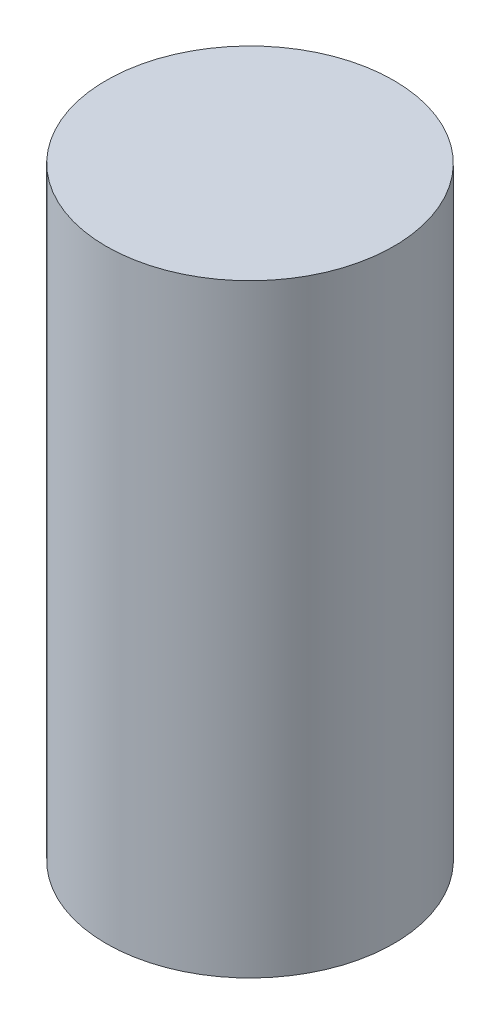
ISO-10303-21;
HEADER;
FILE_DESCRIPTION(('STEP AP214'),'2;1');
FILE_NAME('part.step','',(''),(''),'','','');
FILE_SCHEMA(('AUTOMOTIVE_DESIGN { 1 0 10303 214 1 1 1 1 }'));
ENDSEC;
DATA;
#1=APPLICATION_CONTEXT('core data for automotive mechanical design processes');
#2=APPLICATION_PROTOCOL_DEFINITION('international standard','automotive_design',2000,#1);
#3=PRODUCT_CONTEXT('',#1,'mechanical');
#4=PRODUCT('Part','Part','',(#3));
#5=PRODUCT_RELATED_PRODUCT_CATEGORY('part','',(#4));
#6=PRODUCT_DEFINITION_FORMATION('','',#4);
#7=PRODUCT_DEFINITION_CONTEXT('part definition',#1,'design');
#8=PRODUCT_DEFINITION('design','',#6,#7);
#9=PRODUCT_DEFINITION_SHAPE('','',#8);
#10=(LENGTH_UNIT() NAMED_UNIT(*) SI_UNIT(.MILLI.,.METRE.));
#11=(NAMED_UNIT(*) PLANE_ANGLE_UNIT() SI_UNIT($,.RADIAN.));
#12=(NAMED_UNIT(*) SI_UNIT($,.STERADIAN.) SOLID_ANGLE_UNIT());
#13=UNCERTAINTY_MEASURE_WITH_UNIT(LENGTH_MEASURE(1.E-05),#10,'distance_accuracy_value','');
#14=(GEOMETRIC_REPRESENTATION_CONTEXT(3) GLOBAL_UNCERTAINTY_ASSIGNED_CONTEXT((#13)) GLOBAL_UNIT_ASSIGNED_CONTEXT((#10,
#11,#12)) REPRESENTATION_CONTEXT('',''));
#15=CARTESIAN_POINT('',(0.,0.,0.));
#16=DIRECTION('',(0.,0.,1.));
#17=DIRECTION('',(1.,0.,0.));
#18=AXIS2_PLACEMENT_3D('',#15,#16,#17);
#19=CARTESIAN_POINT('',(0.,8.4,0.));
#20=DIRECTION('',(0.,-1.,0.));
#21=DIRECTION('',(0.,0.,-1.));
#22=AXIS2_PLACEMENT_3D('',#19,#20,#21);
#23=CYLINDRICAL_SURFACE('',#22,2.);
#24=CARTESIAN_POINT('',(0.,8.4,0.));
#25=DIRECTION('',(0.,1.,0.));
#26=DIRECTION('',(0.,0.,1.));
#27=AXIS2_PLACEMENT_3D('',#24,#25,#26);
#28=CIRCLE('',#27,2.);
#29=CARTESIAN_POINT('',(0.,8.4,2.));
#30=VERTEX_POINT('',#29);
#31=EDGE_CURVE('E10',#30,#30,#28,.T.);
#32=ORIENTED_EDGE('',*,*,#31,.F.);
#33=EDGE_LOOP('',(#32));
#34=FACE_BOUND('',#33,.T.);
#35=CARTESIAN_POINT('',(0.,0.,0.));
#36=DIRECTION('',(0.,1.,0.));
#37=DIRECTION('',(0.,0.,1.));
#38=AXIS2_PLACEMENT_3D('',#35,#36,#37);
#39=CIRCLE('',#38,2.);
#40=CARTESIAN_POINT('',(0.,0.,2.));
#41=VERTEX_POINT('',#40);
#42=EDGE_CURVE('E40',#41,#41,#39,.T.);
#43=ORIENTED_EDGE('',*,*,#42,.T.);
#44=EDGE_LOOP('',(#43));
#45=FACE_BOUND('',#44,.T.);
#46=ADVANCED_FACE('F37',(#34,#45),#23,.T.);
#47=CARTESIAN_POINT('',(0.,8.4,0.));
#48=DIRECTION('',(0.,1.,0.));
#49=DIRECTION('',(0.,0.,1.));
#50=AXIS2_PLACEMENT_3D('',#47,#48,#49);
#51=PLANE('',#50);
#52=ORIENTED_EDGE('',*,*,#31,.T.);
#53=EDGE_LOOP('',(#52));
#54=FACE_BOUND('',#53,.T.);
#55=ADVANCED_FACE('F54',(#54),#51,.T.);
#56=CARTESIAN_POINT('',(0.,0.,0.));
#57=DIRECTION('',(0.,1.,0.));
#58=DIRECTION('',(0.,0.,1.));
#59=AXIS2_PLACEMENT_3D('',#56,#57,#58);
#60=PLANE('',#59);
#61=ORIENTED_EDGE('',*,*,#42,.F.);
#62=EDGE_LOOP('',(#61));
#63=FACE_BOUND('',#62,.T.);
#64=ADVANCED_FACE('F52',(#63),#60,.F.);
#65=CLOSED_SHELL('',(#46,#55,#64));
#66=MANIFOLD_SOLID_BREP('B2',#65);
#67=ADVANCED_BREP_SHAPE_REPRESENTATION('',(#18,#66),#14);
#68=SHAPE_DEFINITION_REPRESENTATION(#9,#67);
ENDSEC;
END-ISO-10303-21;
